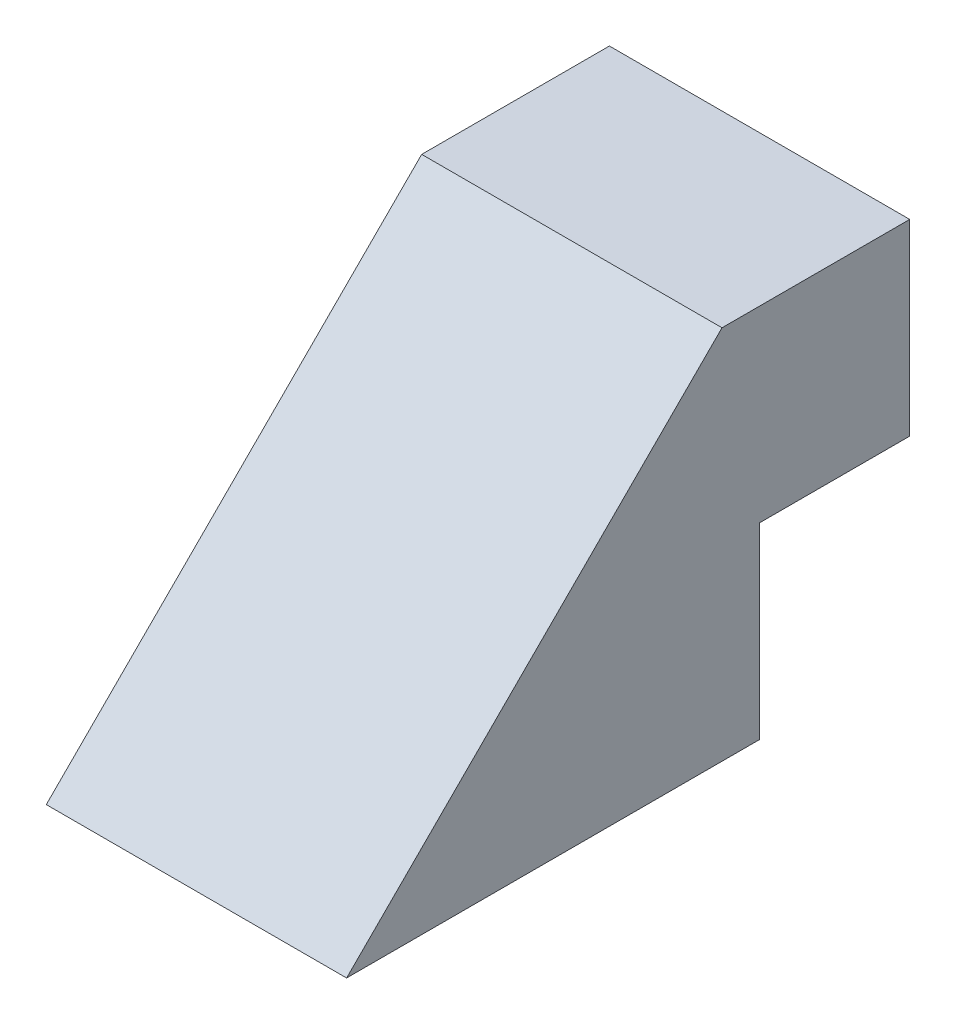
ISO-10303-21;
HEADER;
FILE_DESCRIPTION(('STEP AP214'),'2;1');
FILE_NAME('part.step','',(''),(''),'','','');
FILE_SCHEMA(('AUTOMOTIVE_DESIGN { 1 0 10303 214 1 1 1 1 }'));
ENDSEC;
DATA;
#1=APPLICATION_CONTEXT('core data for automotive mechanical design processes');
#2=APPLICATION_PROTOCOL_DEFINITION('international standard','automotive_design',2000,#1);
#3=PRODUCT_CONTEXT('',#1,'mechanical');
#4=PRODUCT('Part','Part','',(#3));
#5=PRODUCT_RELATED_PRODUCT_CATEGORY('part','',(#4));
#6=PRODUCT_DEFINITION_FORMATION('','',#4);
#7=PRODUCT_DEFINITION_CONTEXT('part definition',#1,'design');
#8=PRODUCT_DEFINITION('design','',#6,#7);
#9=PRODUCT_DEFINITION_SHAPE('','',#8);
#10=(LENGTH_UNIT() NAMED_UNIT(*) SI_UNIT(.MILLI.,.METRE.));
#11=(NAMED_UNIT(*) PLANE_ANGLE_UNIT() SI_UNIT($,.RADIAN.));
#12=(NAMED_UNIT(*) SI_UNIT($,.STERADIAN.) SOLID_ANGLE_UNIT());
#13=UNCERTAINTY_MEASURE_WITH_UNIT(LENGTH_MEASURE(1.E-05),#10,'distance_accuracy_value','');
#14=(GEOMETRIC_REPRESENTATION_CONTEXT(3) GLOBAL_UNCERTAINTY_ASSIGNED_CONTEXT((#13)) GLOBAL_UNIT_ASSIGNED_CONTEXT((#10,
#11,#12)) REPRESENTATION_CONTEXT('',''));
#15=CARTESIAN_POINT('',(0.,0.,0.));
#16=DIRECTION('',(0.,0.,1.));
#17=DIRECTION('',(1.,0.,0.));
#18=AXIS2_PLACEMENT_3D('',#15,#16,#17);
#19=CARTESIAN_POINT('',(0.,5.,-0.5));
#20=DIRECTION('',(0.,0.,1.));
#21=DIRECTION('',(1.,0.,0.));
#22=AXIS2_PLACEMENT_3D('',#19,#20,#21);
#23=PLANE('',#22);
#24=DIRECTION('',(-1.,0.,0.));
#25=VECTOR('',#24,1.);
#26=CARTESIAN_POINT('',(4.,2.5,-0.5));
#27=LINE('',#26,#25);
#28=CARTESIAN_POINT('',(4.,2.5,-0.5));
#29=VERTEX_POINT('',#28);
#30=CARTESIAN_POINT('',(0.,2.5,-0.5));
#31=VERTEX_POINT('',#30);
#32=EDGE_CURVE('E53',#29,#31,#27,.T.);
#33=ORIENTED_EDGE('',*,*,#32,.F.);
#34=DIRECTION('',(0.,-1.,0.));
#35=VECTOR('',#34,1.);
#36=CARTESIAN_POINT('',(4.,5.,-0.5));
#37=LINE('',#36,#35);
#38=CARTESIAN_POINT('',(4.,0.,-0.5));
#39=VERTEX_POINT('',#38);
#40=EDGE_CURVE('E11',#29,#39,#37,.T.);
#41=ORIENTED_EDGE('',*,*,#40,.T.);
#42=DIRECTION('',(-1.,0.,0.));
#43=VECTOR('',#42,1.);
#44=CARTESIAN_POINT('',(0.,0.,-0.5));
#45=LINE('',#44,#43);
#46=CARTESIAN_POINT('',(0.,0.,-0.5));
#47=VERTEX_POINT('',#46);
#48=EDGE_CURVE('E86',#39,#47,#45,.T.);
#49=ORIENTED_EDGE('',*,*,#48,.T.);
#50=DIRECTION('',(0.,-1.,0.));
#51=VECTOR('',#50,1.);
#52=CARTESIAN_POINT('',(0.,5.,-0.5));
#53=LINE('',#52,#51);
#54=EDGE_CURVE('E47',#31,#47,#53,.T.);
#55=ORIENTED_EDGE('',*,*,#54,.F.);
#56=EDGE_LOOP('',(#33,#41,#49,#55));
#57=FACE_BOUND('',#56,.T.);
#58=ADVANCED_FACE('F39',(#57),#23,.F.);
#59=CARTESIAN_POINT('',(0.,5.,0.));
#60=DIRECTION('',(1.,0.,0.));
#61=DIRECTION('',(0.,0.,-1.));
#62=AXIS2_PLACEMENT_3D('',#59,#60,#61);
#63=PLANE('',#62);
#64=DIRECTION('',(0.,0.,1.));
#65=VECTOR('',#64,1.);
#66=CARTESIAN_POINT('',(0.,0.,0.));
#67=LINE('',#66,#65);
#68=CARTESIAN_POINT('',(0.,0.,5.));
#69=VERTEX_POINT('',#68);
#70=EDGE_CURVE('E78',#47,#69,#67,.T.);
#71=ORIENTED_EDGE('',*,*,#70,.T.);
#72=DIRECTION('',(0.,0.707106781186548,-0.707106781186548));
#73=VECTOR('',#72,1.);
#74=CARTESIAN_POINT('',(0.,0.,5.));
#75=LINE('',#74,#73);
#76=CARTESIAN_POINT('',(0.,5.,0.));
#77=VERTEX_POINT('',#76);
#78=EDGE_CURVE('E122',#69,#77,#75,.T.);
#79=ORIENTED_EDGE('',*,*,#78,.T.);
#80=DIRECTION('',(0.,0.,1.));
#81=VECTOR('',#80,1.);
#82=CARTESIAN_POINT('',(0.,5.,0.));
#83=LINE('',#82,#81);
#84=CARTESIAN_POINT('',(0.,5.,-2.5));
#85=VERTEX_POINT('',#84);
#86=EDGE_CURVE('E90',#85,#77,#83,.T.);
#87=ORIENTED_EDGE('',*,*,#86,.F.);
#88=DIRECTION('',(0.,1.,0.));
#89=VECTOR('',#88,1.);
#90=CARTESIAN_POINT('',(0.,5.,-2.5));
#91=LINE('',#90,#89);
#92=CARTESIAN_POINT('',(0.,2.5,-2.5));
#93=VERTEX_POINT('',#92);
#94=EDGE_CURVE('E112',#93,#85,#91,.T.);
#95=ORIENTED_EDGE('',*,*,#94,.F.);
#96=DIRECTION('',(0.,0.,1.));
#97=VECTOR('',#96,1.);
#98=CARTESIAN_POINT('',(0.,2.5,-2.5));
#99=LINE('',#98,#97);
#100=EDGE_CURVE('E83',#93,#31,#99,.T.);
#101=ORIENTED_EDGE('',*,*,#100,.T.);
#102=ORIENTED_EDGE('',*,*,#54,.T.);
#103=EDGE_LOOP('',(#71,#79,#87,#95,#101,#102));
#104=FACE_BOUND('',#103,.T.);
#105=ADVANCED_FACE('F41',(#104),#63,.F.);
#106=CARTESIAN_POINT('',(4.,5.,0.));
#107=DIRECTION('',(-1.,0.,0.));
#108=DIRECTION('',(0.,0.,1.));
#109=AXIS2_PLACEMENT_3D('',#106,#107,#108);
#110=PLANE('',#109);
#111=DIRECTION('',(0.,0.,-1.));
#112=VECTOR('',#111,1.);
#113=CARTESIAN_POINT('',(4.,0.,0.));
#114=LINE('',#113,#112);
#115=CARTESIAN_POINT('',(4.,0.,5.));
#116=VERTEX_POINT('',#115);
#117=EDGE_CURVE('E91',#116,#39,#114,.T.);
#118=ORIENTED_EDGE('',*,*,#117,.T.);
#119=ORIENTED_EDGE('',*,*,#40,.F.);
#120=DIRECTION('',(0.,0.,1.));
#121=VECTOR('',#120,1.);
#122=CARTESIAN_POINT('',(4.,2.5,-2.5));
#123=LINE('',#122,#121);
#124=CARTESIAN_POINT('',(4.,2.5,-2.5));
#125=VERTEX_POINT('',#124);
#126=EDGE_CURVE('E97',#125,#29,#123,.T.);
#127=ORIENTED_EDGE('',*,*,#126,.F.);
#128=DIRECTION('',(0.,-1.,0.));
#129=VECTOR('',#128,1.);
#130=CARTESIAN_POINT('',(4.,5.,-2.5));
#131=LINE('',#130,#129);
#132=CARTESIAN_POINT('',(4.,5.,-2.5));
#133=VERTEX_POINT('',#132);
#134=EDGE_CURVE('E109',#133,#125,#131,.T.);
#135=ORIENTED_EDGE('',*,*,#134,.F.);
#136=DIRECTION('',(0.,0.,-1.));
#137=VECTOR('',#136,1.);
#138=CARTESIAN_POINT('',(4.,5.,0.));
#139=LINE('',#138,#137);
#140=CARTESIAN_POINT('',(4.,5.,0.));
#141=VERTEX_POINT('',#140);
#142=EDGE_CURVE('E84',#141,#133,#139,.T.);
#143=ORIENTED_EDGE('',*,*,#142,.F.);
#144=DIRECTION('',(0.,0.707106781186548,-0.707106781186548));
#145=VECTOR('',#144,1.);
#146=CARTESIAN_POINT('',(4.,0.,5.));
#147=LINE('',#146,#145);
#148=EDGE_CURVE('E121',#116,#141,#147,.T.);
#149=ORIENTED_EDGE('',*,*,#148,.F.);
#150=EDGE_LOOP('',(#118,#119,#127,#135,#143,#149));
#151=FACE_BOUND('',#150,.T.);
#152=ADVANCED_FACE('F130',(#151),#110,.F.);
#153=CARTESIAN_POINT('',(0.,5.,0.));
#154=DIRECTION('',(0.,-1.,0.));
#155=DIRECTION('',(0.,0.,-1.));
#156=AXIS2_PLACEMENT_3D('',#153,#154,#155);
#157=PLANE('',#156);
#158=ORIENTED_EDGE('',*,*,#86,.T.);
#159=DIRECTION('',(1.,0.,0.));
#160=VECTOR('',#159,1.);
#161=CARTESIAN_POINT('',(0.,5.,0.));
#162=LINE('',#161,#160);
#163=EDGE_CURVE('E62',#77,#141,#162,.T.);
#164=ORIENTED_EDGE('',*,*,#163,.T.);
#165=ORIENTED_EDGE('',*,*,#142,.T.);
#166=DIRECTION('',(1.,0.,0.));
#167=VECTOR('',#166,1.);
#168=CARTESIAN_POINT('',(4.,5.,-2.5));
#169=LINE('',#168,#167);
#170=EDGE_CURVE('E107',#85,#133,#169,.T.);
#171=ORIENTED_EDGE('',*,*,#170,.F.);
#172=EDGE_LOOP('',(#158,#164,#165,#171));
#173=FACE_BOUND('',#172,.T.);
#174=ADVANCED_FACE('F144',(#173),#157,.F.);
#175=CARTESIAN_POINT('',(0.,0.,0.));
#176=DIRECTION('',(0.,-1.,0.));
#177=DIRECTION('',(0.,0.,-1.));
#178=AXIS2_PLACEMENT_3D('',#175,#176,#177);
#179=PLANE('',#178);
#180=ORIENTED_EDGE('',*,*,#70,.F.);
#181=ORIENTED_EDGE('',*,*,#48,.F.);
#182=ORIENTED_EDGE('',*,*,#117,.F.);
#183=DIRECTION('',(-1.,0.,0.));
#184=VECTOR('',#183,1.);
#185=CARTESIAN_POINT('',(4.,0.,5.));
#186=LINE('',#185,#184);
#187=EDGE_CURVE('E95',#116,#69,#186,.T.);
#188=ORIENTED_EDGE('',*,*,#187,.T.);
#189=EDGE_LOOP('',(#180,#181,#182,#188));
#190=FACE_BOUND('',#189,.T.);
#191=ADVANCED_FACE('F93',(#190),#179,.T.);
#192=CARTESIAN_POINT('',(4.,2.5,-2.5));
#193=DIRECTION('',(0.,1.,0.));
#194=DIRECTION('',(0.,0.,1.));
#195=AXIS2_PLACEMENT_3D('',#192,#193,#194);
#196=PLANE('',#195);
#197=ORIENTED_EDGE('',*,*,#32,.T.);
#198=ORIENTED_EDGE('',*,*,#100,.F.);
#199=DIRECTION('',(-1.,0.,0.));
#200=VECTOR('',#199,1.);
#201=CARTESIAN_POINT('',(4.,2.5,-2.5));
#202=LINE('',#201,#200);
#203=EDGE_CURVE('E115',#125,#93,#202,.T.);
#204=ORIENTED_EDGE('',*,*,#203,.F.);
#205=ORIENTED_EDGE('',*,*,#126,.T.);
#206=EDGE_LOOP('',(#197,#198,#204,#205));
#207=FACE_BOUND('',#206,.T.);
#208=ADVANCED_FACE('F149',(#207),#196,.F.);
#209=CARTESIAN_POINT('',(0.,0.,-2.5));
#210=DIRECTION('',(0.,0.,-1.));
#211=DIRECTION('',(-1.,0.,0.));
#212=AXIS2_PLACEMENT_3D('',#209,#210,#211);
#213=PLANE('',#212);
#214=ORIENTED_EDGE('',*,*,#134,.T.);
#215=ORIENTED_EDGE('',*,*,#203,.T.);
#216=ORIENTED_EDGE('',*,*,#94,.T.);
#217=ORIENTED_EDGE('',*,*,#170,.T.);
#218=EDGE_LOOP('',(#214,#215,#216,#217));
#219=FACE_BOUND('',#218,.T.);
#220=ADVANCED_FACE('F146',(#219),#213,.T.);
#221=CARTESIAN_POINT('',(4.,0.,5.));
#222=DIRECTION('',(0.,0.707106781186547,0.707106781186547));
#223=DIRECTION('',(0.,-0.707106781186548,0.707106781186548));
#224=AXIS2_PLACEMENT_3D('',#221,#222,#223);
#225=PLANE('',#224);
#226=ORIENTED_EDGE('',*,*,#78,.F.);
#227=ORIENTED_EDGE('',*,*,#187,.F.);
#228=ORIENTED_EDGE('',*,*,#148,.T.);
#229=ORIENTED_EDGE('',*,*,#163,.F.);
#230=EDGE_LOOP('',(#226,#227,#228,#229));
#231=FACE_BOUND('',#230,.T.);
#232=ADVANCED_FACE('F127',(#231),#225,.T.);
#233=CLOSED_SHELL('',(#58,#105,#152,#174,#191,#208,#220,#232));
#234=MANIFOLD_SOLID_BREP('B2',#233);
#235=ADVANCED_BREP_SHAPE_REPRESENTATION('',(#18,#234),#14);
#236=SHAPE_DEFINITION_REPRESENTATION(#9,#235);
ENDSEC;
END-ISO-10303-21;
